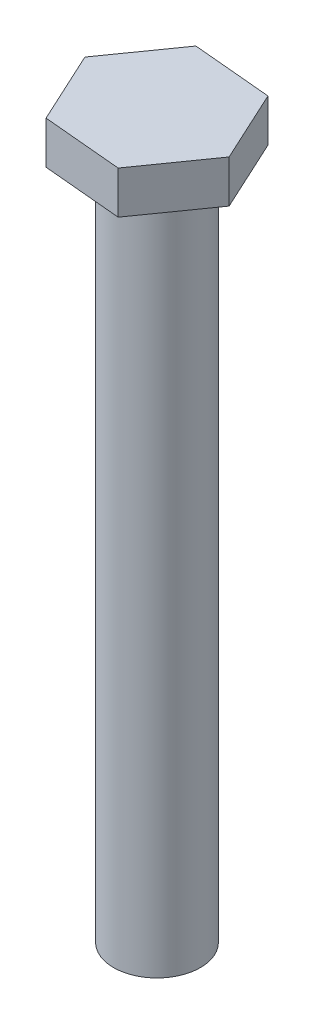
ISO-10303-21;
HEADER;
FILE_DESCRIPTION(('STEP AP214'),'2;1');
FILE_NAME('part.step','',(''),(''),'','','');
FILE_SCHEMA(('AUTOMOTIVE_DESIGN { 1 0 10303 214 1 1 1 1 }'));
ENDSEC;
DATA;
#1=APPLICATION_CONTEXT('core data for automotive mechanical design processes');
#2=APPLICATION_PROTOCOL_DEFINITION('international standard','automotive_design',2000,#1);
#3=PRODUCT_CONTEXT('',#1,'mechanical');
#4=PRODUCT('Part','Part','',(#3));
#5=PRODUCT_RELATED_PRODUCT_CATEGORY('part','',(#4));
#6=PRODUCT_DEFINITION_FORMATION('','',#4);
#7=PRODUCT_DEFINITION_CONTEXT('part definition',#1,'design');
#8=PRODUCT_DEFINITION('design','',#6,#7);
#9=PRODUCT_DEFINITION_SHAPE('','',#8);
#10=(LENGTH_UNIT() NAMED_UNIT(*) SI_UNIT(.MILLI.,.METRE.));
#11=(NAMED_UNIT(*) PLANE_ANGLE_UNIT() SI_UNIT($,.RADIAN.));
#12=(NAMED_UNIT(*) SI_UNIT($,.STERADIAN.) SOLID_ANGLE_UNIT());
#13=UNCERTAINTY_MEASURE_WITH_UNIT(LENGTH_MEASURE(1.E-05),#10,'distance_accuracy_value','');
#14=(GEOMETRIC_REPRESENTATION_CONTEXT(3) GLOBAL_UNCERTAINTY_ASSIGNED_CONTEXT((#13)) GLOBAL_UNIT_ASSIGNED_CONTEXT((#10,
#11,#12)) REPRESENTATION_CONTEXT('',''));
#15=CARTESIAN_POINT('',(0.,0.,0.));
#16=DIRECTION('',(0.,0.,1.));
#17=DIRECTION('',(1.,0.,0.));
#18=AXIS2_PLACEMENT_3D('',#15,#16,#17);
#19=CARTESIAN_POINT('',(0.,-40.,0.));
#20=DIRECTION('',(0.,1.,0.));
#21=DIRECTION('',(0.,0.,1.));
#22=AXIS2_PLACEMENT_3D('',#19,#20,#21);
#23=CYLINDRICAL_SURFACE('',#22,2.55);
#24=CARTESIAN_POINT('',(0.,-40.,0.));
#25=DIRECTION('',(0.,1.,0.));
#26=DIRECTION('',(0.,0.,1.));
#27=AXIS2_PLACEMENT_3D('',#24,#25,#26);
#28=CIRCLE('',#27,2.55);
#29=CARTESIAN_POINT('',(0.,-40.,2.55));
#30=VERTEX_POINT('',#29);
#31=EDGE_CURVE('E11',#30,#30,#28,.T.);
#32=ORIENTED_EDGE('',*,*,#31,.T.);
#33=EDGE_LOOP('',(#32));
#34=FACE_BOUND('',#33,.T.);
#35=CARTESIAN_POINT('',(0.,0.,0.));
#36=DIRECTION('',(0.,1.,0.));
#37=DIRECTION('',(0.,0.,1.));
#38=AXIS2_PLACEMENT_3D('',#35,#36,#37);
#39=CIRCLE('',#38,2.55);
#40=CARTESIAN_POINT('',(0.,0.,2.55));
#41=VERTEX_POINT('',#40);
#42=EDGE_CURVE('E36',#41,#41,#39,.T.);
#43=ORIENTED_EDGE('',*,*,#42,.F.);
#44=EDGE_LOOP('',(#43));
#45=FACE_BOUND('',#44,.T.);
#46=ADVANCED_FACE('F33',(#34,#45),#23,.T.);
#47=CARTESIAN_POINT('',(0.,-40.,0.));
#48=DIRECTION('',(0.,1.,0.));
#49=DIRECTION('',(0.,0.,1.));
#50=AXIS2_PLACEMENT_3D('',#47,#48,#49);
#51=PLANE('',#50);
#52=ORIENTED_EDGE('',*,*,#31,.F.);
#53=EDGE_LOOP('',(#52));
#54=FACE_BOUND('',#53,.T.);
#55=ADVANCED_FACE('F144',(#54),#51,.F.);
#56=CARTESIAN_POINT('',(4.6573643586893,2.5,0.423033367963548));
#57=DIRECTION('',(-0.90770421991838,0.,0.419610592266646));
#58=DIRECTION('',(0.419610592266646,0.,0.90770421991838));
#59=AXIS2_PLACEMENT_3D('',#56,#57,#58);
#60=PLANE('',#59);
#61=DIRECTION('',(-0.419610592266646,0.,-0.90770421991838));
#62=VECTOR('',#61,1.);
#63=CARTESIAN_POINT('',(4.6573643586893,0.,0.423033367963548));
#64=LINE('',#63,#62);
#65=CARTESIAN_POINT('',(4.6573643586893,0.,0.423033367963548));
#66=VERTEX_POINT('',#65);
#67=CARTESIAN_POINT('',(2.69503982264958,0.,-3.82187916532338));
#68=VERTEX_POINT('',#67);
#69=EDGE_CURVE('E118',#66,#68,#64,.T.);
#70=ORIENTED_EDGE('',*,*,#69,.T.);
#71=DIRECTION('',(0.,-1.,0.));
#72=VECTOR('',#71,1.);
#73=CARTESIAN_POINT('',(2.69503982264958,2.5,-3.82187916532338));
#74=LINE('',#73,#72);
#75=CARTESIAN_POINT('',(2.69503982264958,2.5,-3.82187916532338));
#76=VERTEX_POINT('',#75);
#77=EDGE_CURVE('E135',#76,#68,#74,.T.);
#78=ORIENTED_EDGE('',*,*,#77,.F.);
#79=DIRECTION('',(-0.419610592266646,0.,-0.90770421991838));
#80=VECTOR('',#79,1.);
#81=CARTESIAN_POINT('',(4.6573643586893,2.5,0.423033367963548));
#82=LINE('',#81,#80);
#83=CARTESIAN_POINT('',(4.6573643586893,2.5,0.423033367963548));
#84=VERTEX_POINT('',#83);
#85=EDGE_CURVE('E128',#84,#76,#82,.T.);
#86=ORIENTED_EDGE('',*,*,#85,.F.);
#87=DIRECTION('',(0.,-1.,0.));
#88=VECTOR('',#87,1.);
#89=CARTESIAN_POINT('',(4.6573643586893,2.5,0.423033367963548));
#90=LINE('',#89,#88);
#91=EDGE_CURVE('E114',#84,#66,#90,.T.);
#92=ORIENTED_EDGE('',*,*,#91,.T.);
#93=EDGE_LOOP('',(#70,#78,#86,#92));
#94=FACE_BOUND('',#93,.T.);
#95=ADVANCED_FACE('F149',(#94),#60,.F.);
#96=CARTESIAN_POINT('',(2.69503982264958,2.5,-3.82187916532338));
#97=DIRECTION('',(-0.0904586773592406,0.,0.995900209704977));
#98=DIRECTION('',(0.995900209704977,0.,0.0904586773592406));
#99=AXIS2_PLACEMENT_3D('',#96,#97,#98);
#100=PLANE('',#99);
#101=DIRECTION('',(-0.995900209704977,0.,-0.0904586773592406));
#102=VECTOR('',#101,1.);
#103=CARTESIAN_POINT('',(2.69503982264958,0.,-3.82187916532338));
#104=LINE('',#103,#102);
#105=CARTESIAN_POINT('',(-1.96232453603973,0.,-4.24491253328693));
#106=VERTEX_POINT('',#105);
#107=EDGE_CURVE('E121',#68,#106,#104,.T.);
#108=ORIENTED_EDGE('',*,*,#107,.T.);
#109=DIRECTION('',(0.,-1.,0.));
#110=VECTOR('',#109,1.);
#111=CARTESIAN_POINT('',(-1.96232453603973,2.5,-4.24491253328693));
#112=LINE('',#111,#110);
#113=CARTESIAN_POINT('',(-1.96232453603973,2.5,-4.24491253328693));
#114=VERTEX_POINT('',#113);
#115=EDGE_CURVE('E132',#114,#106,#112,.T.);
#116=ORIENTED_EDGE('',*,*,#115,.F.);
#117=DIRECTION('',(-0.995900209704977,0.,-0.0904586773592406));
#118=VECTOR('',#117,1.);
#119=CARTESIAN_POINT('',(2.69503982264958,2.5,-3.82187916532338));
#120=LINE('',#119,#118);
#121=EDGE_CURVE('E87',#76,#114,#120,.T.);
#122=ORIENTED_EDGE('',*,*,#121,.F.);
#123=ORIENTED_EDGE('',*,*,#77,.T.);
#124=EDGE_LOOP('',(#108,#116,#122,#123));
#125=FACE_BOUND('',#124,.T.);
#126=ADVANCED_FACE('F155',(#125),#100,.F.);
#127=CARTESIAN_POINT('',(-1.96232453603973,2.5,-4.24491253328693));
#128=DIRECTION('',(0.81724554255914,0.,0.576289617438331));
#129=DIRECTION('',(0.576289617438331,0.,-0.81724554255914));
#130=AXIS2_PLACEMENT_3D('',#127,#128,#129);
#131=PLANE('',#130);
#132=DIRECTION('',(-0.576289617438331,0.,0.81724554255914));
#133=VECTOR('',#132,1.);
#134=CARTESIAN_POINT('',(-1.96232453603973,0.,-4.24491253328693));
#135=LINE('',#134,#133);
#136=CARTESIAN_POINT('',(-4.6573643586893,0.,-0.423033367963548));
#137=VERTEX_POINT('',#136);
#138=EDGE_CURVE('E123',#106,#137,#135,.T.);
#139=ORIENTED_EDGE('',*,*,#138,.T.);
#140=DIRECTION('',(0.,-1.,0.));
#141=VECTOR('',#140,1.);
#142=CARTESIAN_POINT('',(-4.6573643586893,2.5,-0.423033367963548));
#143=LINE('',#142,#141);
#144=CARTESIAN_POINT('',(-4.6573643586893,2.5,-0.423033367963548));
#145=VERTEX_POINT('',#144);
#146=EDGE_CURVE('E109',#145,#137,#143,.T.);
#147=ORIENTED_EDGE('',*,*,#146,.F.);
#148=DIRECTION('',(-0.576289617438331,0.,0.81724554255914));
#149=VECTOR('',#148,1.);
#150=CARTESIAN_POINT('',(-1.96232453603973,2.5,-4.24491253328693));
#151=LINE('',#150,#149);
#152=EDGE_CURVE('E100',#114,#145,#151,.T.);
#153=ORIENTED_EDGE('',*,*,#152,.F.);
#154=ORIENTED_EDGE('',*,*,#115,.T.);
#155=EDGE_LOOP('',(#139,#147,#153,#154));
#156=FACE_BOUND('',#155,.T.);
#157=ADVANCED_FACE('F161',(#156),#131,.F.);
#158=CARTESIAN_POINT('',(-4.6573643586893,2.5,-0.423033367963548));
#159=DIRECTION('',(0.90770421991838,0.,-0.419610592266646));
#160=DIRECTION('',(-0.419610592266646,0.,-0.90770421991838));
#161=AXIS2_PLACEMENT_3D('',#158,#159,#160);
#162=PLANE('',#161);
#163=DIRECTION('',(0.419610592266646,0.,0.90770421991838));
#164=VECTOR('',#163,1.);
#165=CARTESIAN_POINT('',(-4.6573643586893,0.,-0.423033367963548));
#166=LINE('',#165,#164);
#167=CARTESIAN_POINT('',(-2.69503982264957,0.,3.82187916532338));
#168=VERTEX_POINT('',#167);
#169=EDGE_CURVE('E108',#137,#168,#166,.T.);
#170=ORIENTED_EDGE('',*,*,#169,.T.);
#171=DIRECTION('',(0.,-1.,0.));
#172=VECTOR('',#171,1.);
#173=CARTESIAN_POINT('',(-2.69503982264957,2.5,3.82187916532338));
#174=LINE('',#173,#172);
#175=CARTESIAN_POINT('',(-2.69503982264957,2.5,3.82187916532338));
#176=VERTEX_POINT('',#175);
#177=EDGE_CURVE('E105',#176,#168,#174,.T.);
#178=ORIENTED_EDGE('',*,*,#177,.F.);
#179=DIRECTION('',(0.419610592266646,0.,0.90770421991838));
#180=VECTOR('',#179,1.);
#181=CARTESIAN_POINT('',(-4.6573643586893,2.5,-0.423033367963548));
#182=LINE('',#181,#180);
#183=EDGE_CURVE('E94',#145,#176,#182,.T.);
#184=ORIENTED_EDGE('',*,*,#183,.F.);
#185=ORIENTED_EDGE('',*,*,#146,.T.);
#186=EDGE_LOOP('',(#170,#178,#184,#185));
#187=FACE_BOUND('',#186,.T.);
#188=ADVANCED_FACE('F106',(#187),#162,.F.);
#189=CARTESIAN_POINT('',(-2.69503982264957,2.5,3.82187916532338));
#190=DIRECTION('',(0.0904586773592405,0.,-0.995900209704977));
#191=DIRECTION('',(-0.995900209704977,0.,-0.0904586773592405));
#192=AXIS2_PLACEMENT_3D('',#189,#190,#191);
#193=PLANE('',#192);
#194=DIRECTION('',(0.995900209704977,0.,0.0904586773592405));
#195=VECTOR('',#194,1.);
#196=CARTESIAN_POINT('',(-2.69503982264957,0.,3.82187916532338));
#197=LINE('',#196,#195);
#198=CARTESIAN_POINT('',(1.96232453603973,0.,4.24491253328693));
#199=VERTEX_POINT('',#198);
#200=EDGE_CURVE('E72',#168,#199,#197,.T.);
#201=ORIENTED_EDGE('',*,*,#200,.T.);
#202=DIRECTION('',(0.,-1.,0.));
#203=VECTOR('',#202,1.);
#204=CARTESIAN_POINT('',(1.96232453603973,2.5,4.24491253328693));
#205=LINE('',#204,#203);
#206=CARTESIAN_POINT('',(1.96232453603973,2.5,4.24491253328693));
#207=VERTEX_POINT('',#206);
#208=EDGE_CURVE('E110',#207,#199,#205,.T.);
#209=ORIENTED_EDGE('',*,*,#208,.F.);
#210=DIRECTION('',(0.995900209704977,0.,0.0904586773592405));
#211=VECTOR('',#210,1.);
#212=CARTESIAN_POINT('',(-2.69503982264957,2.5,3.82187916532338));
#213=LINE('',#212,#211);
#214=EDGE_CURVE('E98',#176,#207,#213,.T.);
#215=ORIENTED_EDGE('',*,*,#214,.F.);
#216=ORIENTED_EDGE('',*,*,#177,.T.);
#217=EDGE_LOOP('',(#201,#209,#215,#216));
#218=FACE_BOUND('',#217,.T.);
#219=ADVANCED_FACE('F112',(#218),#193,.F.);
#220=CARTESIAN_POINT('',(1.96232453603973,2.5,4.24491253328693));
#221=DIRECTION('',(-0.817245542559139,0.,-0.576289617438331));
#222=DIRECTION('',(-0.576289617438331,0.,0.81724554255914));
#223=AXIS2_PLACEMENT_3D('',#220,#221,#222);
#224=PLANE('',#223);
#225=DIRECTION('',(0.576289617438331,0.,-0.817245542559139));
#226=VECTOR('',#225,1.);
#227=CARTESIAN_POINT('',(1.96232453603973,0.,4.24491253328693));
#228=LINE('',#227,#226);
#229=EDGE_CURVE('E78',#199,#66,#228,.T.);
#230=ORIENTED_EDGE('',*,*,#229,.T.);
#231=ORIENTED_EDGE('',*,*,#91,.F.);
#232=DIRECTION('',(0.576289617438331,0.,-0.817245542559139));
#233=VECTOR('',#232,1.);
#234=CARTESIAN_POINT('',(1.96232453603973,2.5,4.24491253328693));
#235=LINE('',#234,#233);
#236=EDGE_CURVE('E49',#207,#84,#235,.T.);
#237=ORIENTED_EDGE('',*,*,#236,.F.);
#238=ORIENTED_EDGE('',*,*,#208,.T.);
#239=EDGE_LOOP('',(#230,#231,#237,#238));
#240=FACE_BOUND('',#239,.T.);
#241=ADVANCED_FACE('F169',(#240),#224,.F.);
#242=CARTESIAN_POINT('',(0.,2.5,0.));
#243=DIRECTION('',(0.,1.,0.));
#244=DIRECTION('',(0.,0.,1.));
#245=AXIS2_PLACEMENT_3D('',#242,#243,#244);
#246=PLANE('',#245);
#247=ORIENTED_EDGE('',*,*,#85,.T.);
#248=ORIENTED_EDGE('',*,*,#121,.T.);
#249=ORIENTED_EDGE('',*,*,#152,.T.);
#250=ORIENTED_EDGE('',*,*,#183,.T.);
#251=ORIENTED_EDGE('',*,*,#214,.T.);
#252=ORIENTED_EDGE('',*,*,#236,.T.);
#253=EDGE_LOOP('',(#247,#248,#249,#250,#251,#252));
#254=FACE_BOUND('',#253,.T.);
#255=ADVANCED_FACE('F96',(#254),#246,.T.);
#256=CARTESIAN_POINT('',(0.,0.,0.));
#257=DIRECTION('',(0.,1.,0.));
#258=DIRECTION('',(0.,0.,1.));
#259=AXIS2_PLACEMENT_3D('',#256,#257,#258);
#260=PLANE('',#259);
#261=ORIENTED_EDGE('',*,*,#42,.T.);
#262=EDGE_LOOP('',(#261));
#263=FACE_BOUND('',#262,.T.);
#264=ORIENTED_EDGE('',*,*,#69,.F.);
#265=ORIENTED_EDGE('',*,*,#229,.F.);
#266=ORIENTED_EDGE('',*,*,#200,.F.);
#267=ORIENTED_EDGE('',*,*,#169,.F.);
#268=ORIENTED_EDGE('',*,*,#138,.F.);
#269=ORIENTED_EDGE('',*,*,#107,.F.);
#270=EDGE_LOOP('',(#264,#265,#266,#267,#268,#269));
#271=FACE_BOUND('',#270,.T.);
#272=ADVANCED_FACE('F140',(#263,#271),#260,.F.);
#273=CLOSED_SHELL('',(#46,#55,#95,#126,#157,#188,#219,#241,#255,#272));
#274=MANIFOLD_SOLID_BREP('B2',#273);
#275=ADVANCED_BREP_SHAPE_REPRESENTATION('',(#18,#274),#14);
#276=SHAPE_DEFINITION_REPRESENTATION(#9,#275);
ENDSEC;
END-ISO-10303-21;
